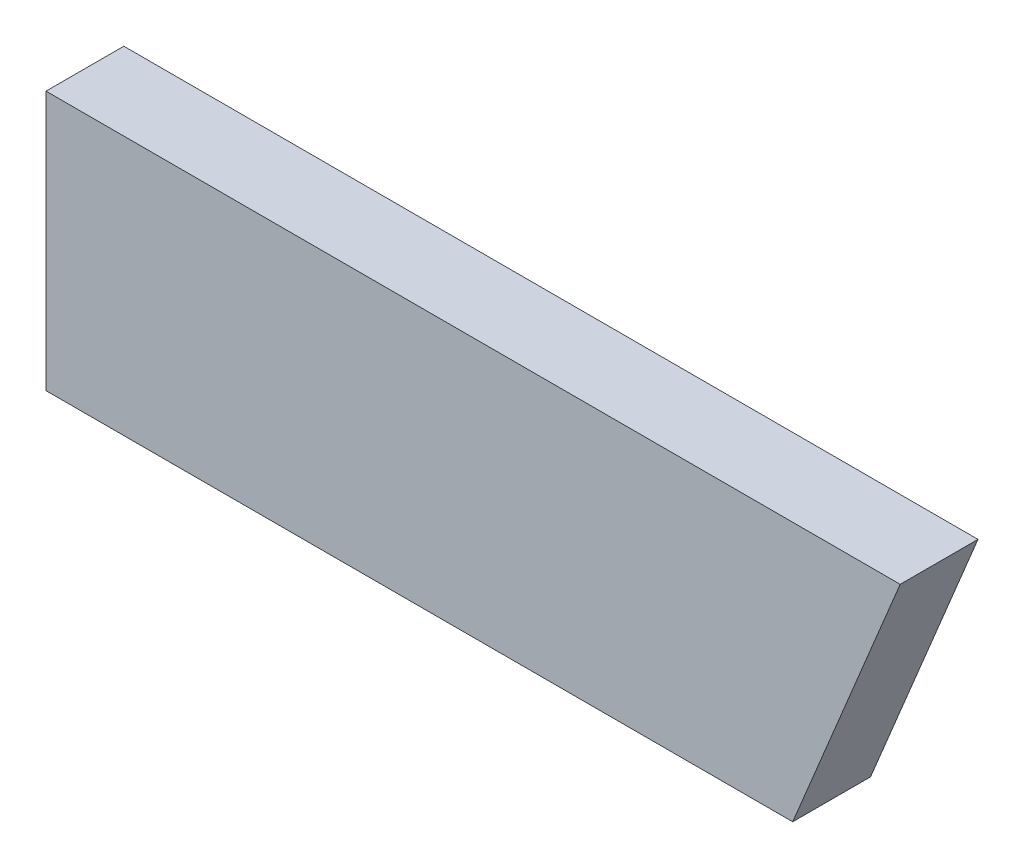
ISO-10303-21;
HEADER;
FILE_DESCRIPTION(('STEP AP214'),'2;1');
FILE_NAME('part.step','',(''),(''),'','','');
FILE_SCHEMA(('AUTOMOTIVE_DESIGN { 1 0 10303 214 1 1 1 1 }'));
ENDSEC;
DATA;
#1=APPLICATION_CONTEXT('core data for automotive mechanical design processes');
#2=APPLICATION_PROTOCOL_DEFINITION('international standard','automotive_design',2000,#1);
#3=PRODUCT_CONTEXT('',#1,'mechanical');
#4=PRODUCT('Part','Part','',(#3));
#5=PRODUCT_RELATED_PRODUCT_CATEGORY('part','',(#4));
#6=PRODUCT_DEFINITION_FORMATION('','',#4);
#7=PRODUCT_DEFINITION_CONTEXT('part definition',#1,'design');
#8=PRODUCT_DEFINITION('design','',#6,#7);
#9=PRODUCT_DEFINITION_SHAPE('','',#8);
#10=(LENGTH_UNIT() NAMED_UNIT(*) SI_UNIT(.MILLI.,.METRE.));
#11=(NAMED_UNIT(*) PLANE_ANGLE_UNIT() SI_UNIT($,.RADIAN.));
#12=(NAMED_UNIT(*) SI_UNIT($,.STERADIAN.) SOLID_ANGLE_UNIT());
#13=UNCERTAINTY_MEASURE_WITH_UNIT(LENGTH_MEASURE(1.E-05),#10,'distance_accuracy_value','');
#14=(GEOMETRIC_REPRESENTATION_CONTEXT(3) GLOBAL_UNCERTAINTY_ASSIGNED_CONTEXT((#13)) GLOBAL_UNIT_ASSIGNED_CONTEXT((#10,
#11,#12)) REPRESENTATION_CONTEXT('',''));
#15=CARTESIAN_POINT('',(0.,0.,0.));
#16=DIRECTION('',(0.,0.,1.));
#17=DIRECTION('',(1.,0.,0.));
#18=AXIS2_PLACEMENT_3D('',#15,#16,#17);
#19=CARTESIAN_POINT('',(-528.085778854874,1843.94678718592,19.05));
#20=DIRECTION('',(-0.923879532511288,0.382683432365086,0.));
#21=DIRECTION('',(-0.382683432365086,-0.923879532511288,0.));
#22=AXIS2_PLACEMENT_3D('',#19,#20,#21);
#23=PLANE('',#22);
#24=DIRECTION('',(0.382683432365086,0.923879532511288,0.));
#25=VECTOR('',#24,1.);
#26=CARTESIAN_POINT('',(-528.085778854874,1843.94678718592,0.));
#27=LINE('',#26,#25);
#28=CARTESIAN_POINT('',(-554.388340065565,1780.44678718592,0.));
#29=VERTEX_POINT('',#28);
#30=CARTESIAN_POINT('',(-528.085778854874,1843.94678718592,0.));
#31=VERTEX_POINT('',#30);
#32=EDGE_CURVE('E96',#29,#31,#27,.T.);
#33=ORIENTED_EDGE('',*,*,#32,.T.);
#34=DIRECTION('',(0.,0.,-1.));
#35=VECTOR('',#34,1.);
#36=CARTESIAN_POINT('',(-528.085778854874,1843.94678718592,19.05));
#37=LINE('',#36,#35);
#38=CARTESIAN_POINT('',(-528.085778854874,1843.94678718592,19.05));
#39=VERTEX_POINT('',#38);
#40=EDGE_CURVE('E11',#39,#31,#37,.T.);
#41=ORIENTED_EDGE('',*,*,#40,.F.);
#42=DIRECTION('',(0.382683432365086,0.923879532511288,0.));
#43=VECTOR('',#42,1.);
#44=CARTESIAN_POINT('',(-528.085778854874,1843.94678718592,19.05));
#45=LINE('',#44,#43);
#46=CARTESIAN_POINT('',(-554.388340065565,1780.44678718592,19.05));
#47=VERTEX_POINT('',#46);
#48=EDGE_CURVE('E84',#47,#39,#45,.T.);
#49=ORIENTED_EDGE('',*,*,#48,.F.);
#50=DIRECTION('',(0.,0.,-1.));
#51=VECTOR('',#50,1.);
#52=CARTESIAN_POINT('',(-554.388340065565,1780.44678718592,19.05));
#53=LINE('',#52,#51);
#54=EDGE_CURVE('E92',#47,#29,#53,.T.);
#55=ORIENTED_EDGE('',*,*,#54,.T.);
#56=EDGE_LOOP('',(#33,#41,#49,#55));
#57=FACE_BOUND('',#56,.T.);
#58=ADVANCED_FACE('F33',(#57),#23,.F.);
#59=CARTESIAN_POINT('',(-528.085778854874,1843.94678718592,19.05));
#60=DIRECTION('',(0.,-1.,0.));
#61=DIRECTION('',(0.,0.,-1.));
#62=AXIS2_PLACEMENT_3D('',#59,#60,#61);
#63=PLANE('',#62);
#64=DIRECTION('',(-1.,0.,0.));
#65=VECTOR('',#64,1.);
#66=CARTESIAN_POINT('',(-528.085778854874,1843.94678718592,0.));
#67=LINE('',#66,#65);
#68=CARTESIAN_POINT('',(-737.184498249528,1843.94678718592,0.));
#69=VERTEX_POINT('',#68);
#70=EDGE_CURVE('E88',#31,#69,#67,.T.);
#71=ORIENTED_EDGE('',*,*,#70,.T.);
#72=DIRECTION('',(0.,0.,-1.));
#73=VECTOR('',#72,1.);
#74=CARTESIAN_POINT('',(-737.184498249528,1843.94678718592,19.05));
#75=LINE('',#74,#73);
#76=CARTESIAN_POINT('',(-737.184498249528,1843.94678718592,19.05));
#77=VERTEX_POINT('',#76);
#78=EDGE_CURVE('E41',#77,#69,#75,.T.);
#79=ORIENTED_EDGE('',*,*,#78,.F.);
#80=DIRECTION('',(-1.,0.,0.));
#81=VECTOR('',#80,1.);
#82=CARTESIAN_POINT('',(-528.085778854874,1843.94678718592,19.05));
#83=LINE('',#82,#81);
#84=EDGE_CURVE('E79',#39,#77,#83,.T.);
#85=ORIENTED_EDGE('',*,*,#84,.F.);
#86=ORIENTED_EDGE('',*,*,#40,.T.);
#87=EDGE_LOOP('',(#71,#79,#85,#86));
#88=FACE_BOUND('',#87,.T.);
#89=ADVANCED_FACE('F87',(#88),#63,.F.);
#90=CARTESIAN_POINT('',(-737.184498249528,1780.44678718592,19.05));
#91=DIRECTION('',(1.,0.,0.));
#92=DIRECTION('',(0.,0.,-1.));
#93=AXIS2_PLACEMENT_3D('',#90,#91,#92);
#94=PLANE('',#93);
#95=DIRECTION('',(0.,-1.,0.));
#96=VECTOR('',#95,1.);
#97=CARTESIAN_POINT('',(-737.184498249528,1780.44678718592,0.));
#98=LINE('',#97,#96);
#99=CARTESIAN_POINT('',(-737.184498249528,1780.44678718592,0.));
#100=VERTEX_POINT('',#99);
#101=EDGE_CURVE('E66',#69,#100,#98,.T.);
#102=ORIENTED_EDGE('',*,*,#101,.T.);
#103=DIRECTION('',(0.,0.,-1.));
#104=VECTOR('',#103,1.);
#105=CARTESIAN_POINT('',(-737.184498249528,1780.44678718592,19.05));
#106=LINE('',#105,#104);
#107=CARTESIAN_POINT('',(-737.184498249528,1780.44678718592,19.05));
#108=VERTEX_POINT('',#107);
#109=EDGE_CURVE('E89',#108,#100,#106,.T.);
#110=ORIENTED_EDGE('',*,*,#109,.F.);
#111=DIRECTION('',(0.,-1.,0.));
#112=VECTOR('',#111,1.);
#113=CARTESIAN_POINT('',(-737.184498249528,1780.44678718592,19.05));
#114=LINE('',#113,#112);
#115=EDGE_CURVE('E82',#77,#108,#114,.T.);
#116=ORIENTED_EDGE('',*,*,#115,.F.);
#117=ORIENTED_EDGE('',*,*,#78,.T.);
#118=EDGE_LOOP('',(#102,#110,#116,#117));
#119=FACE_BOUND('',#118,.T.);
#120=ADVANCED_FACE('F90',(#119),#94,.F.);
#121=CARTESIAN_POINT('',(-737.184498249528,1780.44678718592,19.05));
#122=DIRECTION('',(0.,1.,0.));
#123=DIRECTION('',(0.,0.,1.));
#124=AXIS2_PLACEMENT_3D('',#121,#122,#123);
#125=PLANE('',#124);
#126=DIRECTION('',(1.,0.,0.));
#127=VECTOR('',#126,1.);
#128=CARTESIAN_POINT('',(-737.184498249528,1780.44678718592,0.));
#129=LINE('',#128,#127);
#130=EDGE_CURVE('E72',#100,#29,#129,.T.);
#131=ORIENTED_EDGE('',*,*,#130,.T.);
#132=ORIENTED_EDGE('',*,*,#54,.F.);
#133=DIRECTION('',(1.,0.,0.));
#134=VECTOR('',#133,1.);
#135=CARTESIAN_POINT('',(-737.184498249528,1780.44678718592,19.05));
#136=LINE('',#135,#134);
#137=EDGE_CURVE('E49',#108,#47,#136,.T.);
#138=ORIENTED_EDGE('',*,*,#137,.F.);
#139=ORIENTED_EDGE('',*,*,#109,.T.);
#140=EDGE_LOOP('',(#131,#132,#138,#139));
#141=FACE_BOUND('',#140,.T.);
#142=ADVANCED_FACE('F103',(#141),#125,.F.);
#143=CARTESIAN_POINT('',(0.,0.,19.05));
#144=DIRECTION('',(0.,0.,1.));
#145=DIRECTION('',(1.,0.,0.));
#146=AXIS2_PLACEMENT_3D('',#143,#144,#145);
#147=PLANE('',#146);
#148=ORIENTED_EDGE('',*,*,#48,.T.);
#149=ORIENTED_EDGE('',*,*,#84,.T.);
#150=ORIENTED_EDGE('',*,*,#115,.T.);
#151=ORIENTED_EDGE('',*,*,#137,.T.);
#152=EDGE_LOOP('',(#148,#149,#150,#151));
#153=FACE_BOUND('',#152,.T.);
#154=ADVANCED_FACE('F80',(#153),#147,.T.);
#155=CARTESIAN_POINT('',(0.,0.,0.));
#156=DIRECTION('',(0.,0.,1.));
#157=DIRECTION('',(1.,0.,0.));
#158=AXIS2_PLACEMENT_3D('',#155,#156,#157);
#159=PLANE('',#158);
#160=ORIENTED_EDGE('',*,*,#32,.F.);
#161=ORIENTED_EDGE('',*,*,#130,.F.);
#162=ORIENTED_EDGE('',*,*,#101,.F.);
#163=ORIENTED_EDGE('',*,*,#70,.F.);
#164=EDGE_LOOP('',(#160,#161,#162,#163));
#165=FACE_BOUND('',#164,.T.);
#166=ADVANCED_FACE('F106',(#165),#159,.F.);
#167=CLOSED_SHELL('',(#58,#89,#120,#142,#154,#166));
#168=MANIFOLD_SOLID_BREP('B2',#167);
#169=ADVANCED_BREP_SHAPE_REPRESENTATION('',(#18,#168),#14);
#170=SHAPE_DEFINITION_REPRESENTATION(#9,#169);
ENDSEC;
END-ISO-10303-21;
